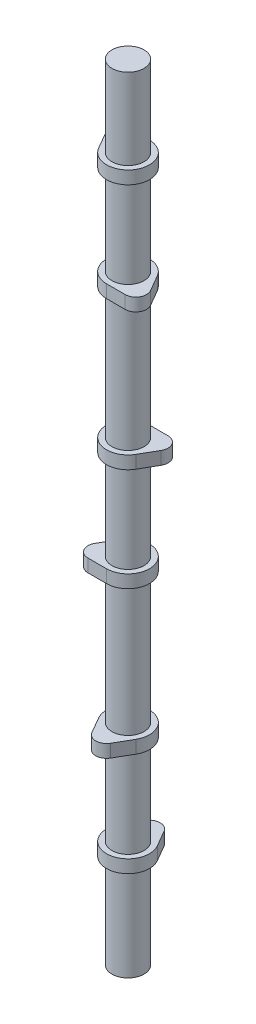
ISO-10303-21;
HEADER;
FILE_DESCRIPTION(('STEP AP214'),'2;1');
FILE_NAME('part.step','',(''),(''),'','','');
FILE_SCHEMA(('AUTOMOTIVE_DESIGN { 1 0 10303 214 1 1 1 1 }'));
ENDSEC;
DATA;
#1=APPLICATION_CONTEXT('core data for automotive mechanical design processes');
#2=APPLICATION_PROTOCOL_DEFINITION('international standard','automotive_design',2000,#1);
#3=PRODUCT_CONTEXT('',#1,'mechanical');
#4=PRODUCT('Part','Part','',(#3));
#5=PRODUCT_RELATED_PRODUCT_CATEGORY('part','',(#4));
#6=PRODUCT_DEFINITION_FORMATION('','',#4);
#7=PRODUCT_DEFINITION_CONTEXT('part definition',#1,'design');
#8=PRODUCT_DEFINITION('design','',#6,#7);
#9=PRODUCT_DEFINITION_SHAPE('','',#8);
#10=(LENGTH_UNIT() NAMED_UNIT(*) SI_UNIT(.MILLI.,.METRE.));
#11=(NAMED_UNIT(*) PLANE_ANGLE_UNIT() SI_UNIT($,.RADIAN.));
#12=(NAMED_UNIT(*) SI_UNIT($,.STERADIAN.) SOLID_ANGLE_UNIT());
#13=UNCERTAINTY_MEASURE_WITH_UNIT(LENGTH_MEASURE(1.E-05),#10,'distance_accuracy_value','');
#14=(GEOMETRIC_REPRESENTATION_CONTEXT(3) GLOBAL_UNCERTAINTY_ASSIGNED_CONTEXT((#13)) GLOBAL_UNIT_ASSIGNED_CONTEXT((#10,
#11,#12)) REPRESENTATION_CONTEXT('',''));
#15=CARTESIAN_POINT('',(0.,0.,0.));
#16=DIRECTION('',(0.,0.,1.));
#17=DIRECTION('',(1.,0.,0.));
#18=AXIS2_PLACEMENT_3D('',#15,#16,#17);
#19=CARTESIAN_POINT('',(0.,404.72,0.));
#20=DIRECTION('',(0.,-1.,0.));
#21=DIRECTION('',(0.,0.,-1.));
#22=AXIS2_PLACEMENT_3D('',#19,#20,#21);
#23=CYLINDRICAL_SURFACE('',#22,9.5);
#24=CARTESIAN_POINT('',(0.,210.82,0.));
#25=DIRECTION('',(0.,1.,0.));
#26=DIRECTION('',(0.,0.,1.));
#27=AXIS2_PLACEMENT_3D('',#24,#25,#26);
#28=CIRCLE('',#27,9.5);
#29=CARTESIAN_POINT('',(0.,210.82,9.5));
#30=VERTEX_POINT('',#29);
#31=EDGE_CURVE('E304',#30,#30,#28,.T.);
#32=ORIENTED_EDGE('',*,*,#31,.T.);
#33=EDGE_LOOP('',(#32));
#34=FACE_BOUND('',#33,.T.);
#35=CARTESIAN_POINT('',(0.,288.29,0.));
#36=DIRECTION('',(0.,1.,0.));
#37=DIRECTION('',(0.,0.,1.));
#38=AXIS2_PLACEMENT_3D('',#35,#36,#37);
#39=CIRCLE('',#38,9.5);
#40=CARTESIAN_POINT('',(0.,288.29,9.5));
#41=VERTEX_POINT('',#40);
#42=EDGE_CURVE('E11',#41,#41,#39,.T.);
#43=ORIENTED_EDGE('',*,*,#42,.F.);
#44=EDGE_LOOP('',(#43));
#45=FACE_BOUND('',#44,.T.);
#46=ADVANCED_FACE('F39',(#34,#45),#23,.T.);
#47=CARTESIAN_POINT('',(0.,149.86,0.));
#48=DIRECTION('',(0.,1.,0.));
#49=DIRECTION('',(0.,0.,1.));
#50=AXIS2_PLACEMENT_3D('',#47,#48,#49);
#51=CIRCLE('',#50,9.5);
#52=CARTESIAN_POINT('',(0.,149.86,9.5));
#53=VERTEX_POINT('',#52);
#54=EDGE_CURVE('E335',#53,#53,#51,.T.);
#55=ORIENTED_EDGE('',*,*,#54,.T.);
#56=EDGE_LOOP('',(#55));
#57=FACE_BOUND('',#56,.T.);
#58=CARTESIAN_POINT('',(0.,203.2,0.));
#59=DIRECTION('',(0.,1.,0.));
#60=DIRECTION('',(0.,0.,1.));
#61=AXIS2_PLACEMENT_3D('',#58,#59,#60);
#62=CIRCLE('',#61,9.5);
#63=CARTESIAN_POINT('',(0.,203.2,9.5));
#64=VERTEX_POINT('',#63);
#65=EDGE_CURVE('E408',#64,#64,#62,.T.);
#66=ORIENTED_EDGE('',*,*,#65,.F.);
#67=EDGE_LOOP('',(#66));
#68=FACE_BOUND('',#67,.T.);
#69=ADVANCED_FACE('F457',(#57,#68),#23,.T.);
#70=CARTESIAN_POINT('',(0.,64.77,0.));
#71=DIRECTION('',(0.,1.,0.));
#72=DIRECTION('',(0.,0.,1.));
#73=AXIS2_PLACEMENT_3D('',#70,#71,#72);
#74=CIRCLE('',#73,9.5);
#75=CARTESIAN_POINT('',(0.,64.77,9.5));
#76=VERTEX_POINT('',#75);
#77=EDGE_CURVE('E366',#76,#76,#74,.T.);
#78=ORIENTED_EDGE('',*,*,#77,.T.);
#79=EDGE_LOOP('',(#78));
#80=FACE_BOUND('',#79,.T.);
#81=CARTESIAN_POINT('',(0.,142.24,0.));
#82=DIRECTION('',(0.,1.,0.));
#83=DIRECTION('',(0.,0.,1.));
#84=AXIS2_PLACEMENT_3D('',#81,#82,#83);
#85=CIRCLE('',#84,9.5);
#86=CARTESIAN_POINT('',(0.,142.24,9.5));
#87=VERTEX_POINT('',#86);
#88=EDGE_CURVE('E403',#87,#87,#85,.T.);
#89=ORIENTED_EDGE('',*,*,#88,.F.);
#90=EDGE_LOOP('',(#89));
#91=FACE_BOUND('',#90,.T.);
#92=ADVANCED_FACE('F465',(#80,#91),#23,.T.);
#93=CARTESIAN_POINT('',(0.,3.80999999999998,0.));
#94=DIRECTION('',(0.,1.,0.));
#95=DIRECTION('',(0.,0.,1.));
#96=AXIS2_PLACEMENT_3D('',#93,#94,#95);
#97=CIRCLE('',#96,9.5);
#98=CARTESIAN_POINT('',(0.,3.80999999999998,9.5));
#99=VERTEX_POINT('',#98);
#100=EDGE_CURVE('E370',#99,#99,#97,.F.);
#101=ORIENTED_EDGE('',*,*,#100,.F.);
#102=EDGE_LOOP('',(#101));
#103=FACE_BOUND('',#102,.T.);
#104=CARTESIAN_POINT('',(0.,57.15,0.));
#105=DIRECTION('',(0.,1.,0.));
#106=DIRECTION('',(0.,0.,1.));
#107=AXIS2_PLACEMENT_3D('',#104,#105,#106);
#108=CIRCLE('',#107,9.5);
#109=CARTESIAN_POINT('',(0.,57.15,9.5));
#110=VERTEX_POINT('',#109);
#111=EDGE_CURVE('E400',#110,#110,#108,.T.);
#112=ORIENTED_EDGE('',*,*,#111,.F.);
#113=EDGE_LOOP('',(#112));
#114=FACE_BOUND('',#113,.T.);
#115=ADVANCED_FACE('F483',(#103,#114),#23,.T.);
#116=CARTESIAN_POINT('',(0.,3.81,-12.7));
#117=DIRECTION('',(0.,-1.,0.));
#118=DIRECTION('',(0.,0.,-1.));
#119=AXIS2_PLACEMENT_3D('',#116,#117,#118);
#120=CYLINDRICAL_SURFACE('',#119,6.35);
#121=CARTESIAN_POINT('',(0.,-3.81,-12.7));
#122=DIRECTION('',(0.,1.,0.));
#123=DIRECTION('',(0.,0.,1.));
#124=AXIS2_PLACEMENT_3D('',#121,#122,#123);
#125=CIRCLE('',#124,6.35);
#126=CARTESIAN_POINT('',(5.49926131403118,-3.81,-15.875));
#127=VERTEX_POINT('',#126);
#128=CARTESIAN_POINT('',(-5.49926131403118,-3.81,-15.875));
#129=VERTEX_POINT('',#128);
#130=EDGE_CURVE('E376',#127,#129,#125,.T.);
#131=ORIENTED_EDGE('',*,*,#130,.T.);
#132=DIRECTION('',(0.,-1.,0.));
#133=VECTOR('',#132,1.);
#134=CARTESIAN_POINT('',(-5.49926131403118,3.81,-15.875));
#135=LINE('',#134,#133);
#136=CARTESIAN_POINT('',(-5.49926131403118,3.81,-15.875));
#137=VERTEX_POINT('',#136);
#138=EDGE_CURVE('E395',#137,#129,#135,.T.);
#139=ORIENTED_EDGE('',*,*,#138,.F.);
#140=CARTESIAN_POINT('',(0.,3.81,-12.7));
#141=DIRECTION('',(0.,1.,0.));
#142=DIRECTION('',(0.,0.,1.));
#143=AXIS2_PLACEMENT_3D('',#140,#141,#142);
#144=CIRCLE('',#143,6.35);
#145=CARTESIAN_POINT('',(5.49926131403118,3.81,-15.875));
#146=VERTEX_POINT('',#145);
#147=EDGE_CURVE('E377',#146,#137,#144,.T.);
#148=ORIENTED_EDGE('',*,*,#147,.F.);
#149=DIRECTION('',(0.,-1.,0.));
#150=VECTOR('',#149,1.);
#151=CARTESIAN_POINT('',(5.49926131403118,3.81,-15.875));
#152=LINE('',#151,#150);
#153=EDGE_CURVE('E383',#146,#127,#152,.T.);
#154=ORIENTED_EDGE('',*,*,#153,.T.);
#155=EDGE_LOOP('',(#131,#139,#148,#154));
#156=FACE_BOUND('',#155,.T.);
#157=ADVANCED_FACE('F41',(#156),#120,.T.);
#158=CARTESIAN_POINT('',(-5.49926131403118,3.81,-15.875));
#159=DIRECTION('',(0.866025403784439,0.,0.5));
#160=DIRECTION('',(0.5,0.,-0.866025403784439));
#161=AXIS2_PLACEMENT_3D('',#158,#159,#160);
#162=PLANE('',#161);
#163=DIRECTION('',(-0.5,0.,0.866025403784439));
#164=VECTOR('',#163,1.);
#165=CARTESIAN_POINT('',(-5.49926131403118,-3.81,-15.875));
#166=LINE('',#165,#164);
#167=CARTESIAN_POINT('',(-10.9985226280624,-3.81,-6.35));
#168=VERTEX_POINT('',#167);
#169=EDGE_CURVE('E386',#129,#168,#166,.T.);
#170=ORIENTED_EDGE('',*,*,#169,.T.);
#171=DIRECTION('',(0.,-1.,0.));
#172=VECTOR('',#171,1.);
#173=CARTESIAN_POINT('',(-10.9985226280624,3.81,-6.35));
#174=LINE('',#173,#172);
#175=CARTESIAN_POINT('',(-10.9985226280624,3.81,-6.35));
#176=VERTEX_POINT('',#175);
#177=EDGE_CURVE('E393',#176,#168,#174,.T.);
#178=ORIENTED_EDGE('',*,*,#177,.F.);
#179=DIRECTION('',(-0.5,0.,0.866025403784439));
#180=VECTOR('',#179,1.);
#181=CARTESIAN_POINT('',(-5.49926131403118,3.81,-15.875));
#182=LINE('',#181,#180);
#183=EDGE_CURVE('E89',#137,#176,#182,.T.);
#184=ORIENTED_EDGE('',*,*,#183,.F.);
#185=ORIENTED_EDGE('',*,*,#138,.T.);
#186=EDGE_LOOP('',(#170,#178,#184,#185));
#187=FACE_BOUND('',#186,.T.);
#188=ADVANCED_FACE('F500',(#187),#162,.F.);
#189=CARTESIAN_POINT('',(0.,3.81,0.));
#190=DIRECTION('',(0.,-1.,0.));
#191=DIRECTION('',(0.,0.,-1.));
#192=AXIS2_PLACEMENT_3D('',#189,#190,#191);
#193=CYLINDRICAL_SURFACE('',#192,12.7);
#194=CARTESIAN_POINT('',(0.,-3.81,0.));
#195=DIRECTION('',(0.,1.,0.));
#196=DIRECTION('',(0.,0.,1.));
#197=AXIS2_PLACEMENT_3D('',#194,#195,#196);
#198=CIRCLE('',#197,12.7);
#199=CARTESIAN_POINT('',(10.9985226280624,-3.81,-6.35000000000001));
#200=VERTEX_POINT('',#199);
#201=EDGE_CURVE('E75',#168,#200,#198,.T.);
#202=ORIENTED_EDGE('',*,*,#201,.T.);
#203=DIRECTION('',(0.,-1.,0.));
#204=VECTOR('',#203,1.);
#205=CARTESIAN_POINT('',(10.9985226280624,3.81,-6.35000000000001));
#206=LINE('',#205,#204);
#207=CARTESIAN_POINT('',(10.9985226280624,3.81,-6.35000000000001));
#208=VERTEX_POINT('',#207);
#209=EDGE_CURVE('E391',#208,#200,#206,.T.);
#210=ORIENTED_EDGE('',*,*,#209,.F.);
#211=CARTESIAN_POINT('',(0.,3.81,0.));
#212=DIRECTION('',(0.,1.,0.));
#213=DIRECTION('',(0.,0.,1.));
#214=AXIS2_PLACEMENT_3D('',#211,#212,#213);
#215=CIRCLE('',#214,12.7);
#216=EDGE_CURVE('E380',#176,#208,#215,.T.);
#217=ORIENTED_EDGE('',*,*,#216,.F.);
#218=ORIENTED_EDGE('',*,*,#177,.T.);
#219=EDGE_LOOP('',(#202,#210,#217,#218));
#220=FACE_BOUND('',#219,.T.);
#221=ADVANCED_FACE('F925',(#220),#193,.T.);
#222=CARTESIAN_POINT('',(5.49926131403118,3.81,-15.875));
#223=DIRECTION('',(-0.866025403784438,0.,0.5));
#224=DIRECTION('',(0.5,0.,0.866025403784439));
#225=AXIS2_PLACEMENT_3D('',#222,#223,#224);
#226=PLANE('',#225);
#227=DIRECTION('',(-0.5,0.,-0.866025403784439));
#228=VECTOR('',#227,1.);
#229=CARTESIAN_POINT('',(5.49926131403118,-3.81,-15.875));
#230=LINE('',#229,#228);
#231=EDGE_CURVE('E81',#200,#127,#230,.T.);
#232=ORIENTED_EDGE('',*,*,#231,.T.);
#233=ORIENTED_EDGE('',*,*,#153,.F.);
#234=DIRECTION('',(-0.5,0.,-0.866025403784439));
#235=VECTOR('',#234,1.);
#236=CARTESIAN_POINT('',(5.49926131403118,3.81,-15.875));
#237=LINE('',#236,#235);
#238=EDGE_CURVE('E57',#208,#146,#237,.T.);
#239=ORIENTED_EDGE('',*,*,#238,.F.);
#240=ORIENTED_EDGE('',*,*,#209,.T.);
#241=EDGE_LOOP('',(#232,#233,#239,#240));
#242=FACE_BOUND('',#241,.T.);
#243=ADVANCED_FACE('F916',(#242),#226,.F.);
#244=CARTESIAN_POINT('',(0.,3.81,-12.7));
#245=DIRECTION('',(0.,1.,0.));
#246=DIRECTION('',(0.,0.,1.));
#247=AXIS2_PLACEMENT_3D('',#244,#245,#246);
#248=PLANE('',#247);
#249=ORIENTED_EDGE('',*,*,#100,.T.);
#250=EDGE_LOOP('',(#249));
#251=FACE_BOUND('',#250,.T.);
#252=ORIENTED_EDGE('',*,*,#147,.T.);
#253=ORIENTED_EDGE('',*,*,#183,.T.);
#254=ORIENTED_EDGE('',*,*,#216,.T.);
#255=ORIENTED_EDGE('',*,*,#238,.T.);
#256=EDGE_LOOP('',(#252,#253,#254,#255));
#257=FACE_BOUND('',#256,.T.);
#258=ADVANCED_FACE('F906',(#251,#257),#248,.T.);
#259=CARTESIAN_POINT('',(0.,-3.81,-12.7));
#260=DIRECTION('',(0.,1.,0.));
#261=DIRECTION('',(0.,0.,1.));
#262=AXIS2_PLACEMENT_3D('',#259,#260,#261);
#263=PLANE('',#262);
#264=CARTESIAN_POINT('',(0.,-3.80999999999998,0.));
#265=DIRECTION('',(0.,1.,0.));
#266=DIRECTION('',(0.,0.,1.));
#267=AXIS2_PLACEMENT_3D('',#264,#265,#266);
#268=CIRCLE('',#267,9.5);
#269=CARTESIAN_POINT('',(0.,-3.80999999999998,9.5));
#270=VERTEX_POINT('',#269);
#271=EDGE_CURVE('E397',#270,#270,#268,.F.);
#272=ORIENTED_EDGE('',*,*,#271,.F.);
#273=EDGE_LOOP('',(#272));
#274=FACE_BOUND('',#273,.T.);
#275=ORIENTED_EDGE('',*,*,#130,.F.);
#276=ORIENTED_EDGE('',*,*,#231,.F.);
#277=ORIENTED_EDGE('',*,*,#201,.F.);
#278=ORIENTED_EDGE('',*,*,#169,.F.);
#279=EDGE_LOOP('',(#275,#276,#277,#278));
#280=FACE_BOUND('',#279,.T.);
#281=ADVANCED_FACE('F491',(#274,#280),#263,.F.);
#282=CARTESIAN_POINT('',(0.,-59.53,0.));
#283=DIRECTION('',(0.,1.,0.));
#284=DIRECTION('',(0.,0.,1.));
#285=AXIS2_PLACEMENT_3D('',#282,#283,#284);
#286=PLANE('',#285);
#287=CARTESIAN_POINT('',(0.,-59.53,0.));
#288=DIRECTION('',(0.,1.,0.));
#289=DIRECTION('',(0.,0.,1.));
#290=AXIS2_PLACEMENT_3D('',#287,#288,#289);
#291=CIRCLE('',#290,9.5);
#292=CARTESIAN_POINT('',(0.,-59.53,9.5));
#293=VERTEX_POINT('',#292);
#294=EDGE_CURVE('E371',#293,#293,#291,.T.);
#295=ORIENTED_EDGE('',*,*,#294,.F.);
#296=EDGE_LOOP('',(#295));
#297=FACE_BOUND('',#296,.T.);
#298=ADVANCED_FACE('F481',(#297),#286,.F.);
#299=ORIENTED_EDGE('',*,*,#294,.T.);
#300=EDGE_LOOP('',(#299));
#301=FACE_BOUND('',#300,.T.);
#302=ORIENTED_EDGE('',*,*,#271,.T.);
#303=EDGE_LOOP('',(#302));
#304=FACE_BOUND('',#303,.T.);
#305=ADVANCED_FACE('F472',(#301,#304),#23,.T.);
#306=CARTESIAN_POINT('',(0.,64.77,12.7));
#307=DIRECTION('',(0.,-1.,0.));
#308=DIRECTION('',(0.,0.,1.));
#309=AXIS2_PLACEMENT_3D('',#306,#307,#308);
#310=CYLINDRICAL_SURFACE('',#309,6.35);
#311=CARTESIAN_POINT('',(0.,57.15,12.7));
#312=DIRECTION('',(0.,1.,0.));
#313=DIRECTION('',(0.,0.,-1.));
#314=AXIS2_PLACEMENT_3D('',#311,#312,#313);
#315=CIRCLE('',#314,6.35);
#316=CARTESIAN_POINT('',(-5.49926131403129,57.15,15.875));
#317=VERTEX_POINT('',#316);
#318=CARTESIAN_POINT('',(5.49926131403107,57.15,15.875));
#319=VERTEX_POINT('',#318);
#320=EDGE_CURVE('E347',#317,#319,#315,.T.);
#321=ORIENTED_EDGE('',*,*,#320,.T.);
#322=DIRECTION('',(0.,-1.,0.));
#323=VECTOR('',#322,1.);
#324=CARTESIAN_POINT('',(5.49926131403107,64.77,15.875));
#325=LINE('',#324,#323);
#326=CARTESIAN_POINT('',(5.49926131403107,64.77,15.875));
#327=VERTEX_POINT('',#326);
#328=EDGE_CURVE('E363',#327,#319,#325,.T.);
#329=ORIENTED_EDGE('',*,*,#328,.F.);
#330=CARTESIAN_POINT('',(0.,64.77,12.7));
#331=DIRECTION('',(0.,1.,0.));
#332=DIRECTION('',(0.,0.,-1.));
#333=AXIS2_PLACEMENT_3D('',#330,#331,#332);
#334=CIRCLE('',#333,6.35);
#335=CARTESIAN_POINT('',(-5.49926131403129,64.77,15.875));
#336=VERTEX_POINT('',#335);
#337=EDGE_CURVE('E336',#336,#327,#334,.T.);
#338=ORIENTED_EDGE('',*,*,#337,.F.);
#339=DIRECTION('',(0.,-1.,0.));
#340=VECTOR('',#339,1.);
#341=CARTESIAN_POINT('',(-5.49926131403129,64.77,15.875));
#342=LINE('',#341,#340);
#343=EDGE_CURVE('E346',#336,#317,#342,.T.);
#344=ORIENTED_EDGE('',*,*,#343,.T.);
#345=EDGE_LOOP('',(#321,#329,#338,#344));
#346=FACE_BOUND('',#345,.T.);
#347=ADVANCED_FACE('F480',(#346),#310,.T.);
#348=CARTESIAN_POINT('',(5.49926131403107,64.77,15.875));
#349=DIRECTION('',(-0.866025403784435,0.,-0.500000000000006));
#350=DIRECTION('',(-0.500000000000006,0.,0.866025403784435));
#351=AXIS2_PLACEMENT_3D('',#348,#349,#350);
#352=PLANE('',#351);
#353=DIRECTION('',(0.500000000000006,0.,-0.866025403784435));
#354=VECTOR('',#353,1.);
#355=CARTESIAN_POINT('',(5.49926131403107,57.15,15.875));
#356=LINE('',#355,#354);
#357=CARTESIAN_POINT('',(10.9985226280623,57.15,6.35000000000008));
#358=VERTEX_POINT('',#357);
#359=EDGE_CURVE('E350',#319,#358,#356,.T.);
#360=ORIENTED_EDGE('',*,*,#359,.T.);
#361=DIRECTION('',(0.,-1.,0.));
#362=VECTOR('',#361,1.);
#363=CARTESIAN_POINT('',(10.9985226280623,64.77,6.35000000000008));
#364=LINE('',#363,#362);
#365=CARTESIAN_POINT('',(10.9985226280623,64.77,6.35000000000008));
#366=VERTEX_POINT('',#365);
#367=EDGE_CURVE('E360',#366,#358,#364,.T.);
#368=ORIENTED_EDGE('',*,*,#367,.F.);
#369=DIRECTION('',(0.500000000000006,0.,-0.866025403784435));
#370=VECTOR('',#369,1.);
#371=CARTESIAN_POINT('',(5.49926131403107,64.77,15.875));
#372=LINE('',#371,#370);
#373=EDGE_CURVE('E339',#327,#366,#372,.T.);
#374=ORIENTED_EDGE('',*,*,#373,.F.);
#375=ORIENTED_EDGE('',*,*,#328,.T.);
#376=EDGE_LOOP('',(#360,#368,#374,#375));
#377=FACE_BOUND('',#376,.T.);
#378=ADVANCED_FACE('F488',(#377),#352,.F.);
#379=CARTESIAN_POINT('',(0.,64.77,0.));
#380=DIRECTION('',(0.,-1.,0.));
#381=DIRECTION('',(0.,0.,1.));
#382=AXIS2_PLACEMENT_3D('',#379,#380,#381);
#383=CYLINDRICAL_SURFACE('',#382,12.7);
#384=CARTESIAN_POINT('',(0.,57.15,0.));
#385=DIRECTION('',(0.,1.,0.));
#386=DIRECTION('',(0.,0.,-1.));
#387=AXIS2_PLACEMENT_3D('',#384,#385,#386);
#388=CIRCLE('',#387,12.7);
#389=CARTESIAN_POINT('',(-10.9985226280624,57.15,6.34999999999994));
#390=VERTEX_POINT('',#389);
#391=EDGE_CURVE('E352',#358,#390,#388,.T.);
#392=ORIENTED_EDGE('',*,*,#391,.T.);
#393=DIRECTION('',(0.,-1.,0.));
#394=VECTOR('',#393,1.);
#395=CARTESIAN_POINT('',(-10.9985226280624,64.77,6.34999999999994));
#396=LINE('',#395,#394);
#397=CARTESIAN_POINT('',(-10.9985226280624,64.77,6.34999999999994));
#398=VERTEX_POINT('',#397);
#399=EDGE_CURVE('E357',#398,#390,#396,.T.);
#400=ORIENTED_EDGE('',*,*,#399,.F.);
#401=CARTESIAN_POINT('',(0.,64.77,0.));
#402=DIRECTION('',(0.,1.,0.));
#403=DIRECTION('',(0.,0.,-1.));
#404=AXIS2_PLACEMENT_3D('',#401,#402,#403);
#405=CIRCLE('',#404,12.7);
#406=EDGE_CURVE('E342',#366,#398,#405,.T.);
#407=ORIENTED_EDGE('',*,*,#406,.F.);
#408=ORIENTED_EDGE('',*,*,#367,.T.);
#409=EDGE_LOOP('',(#392,#400,#407,#408));
#410=FACE_BOUND('',#409,.T.);
#411=ADVANCED_FACE('F525',(#410),#383,.T.);
#412=CARTESIAN_POINT('',(-5.49926131403129,64.77,15.875));
#413=DIRECTION('',(0.866025403784442,0.,-0.499999999999994));
#414=DIRECTION('',(-0.499999999999994,0.,-0.866025403784442));
#415=AXIS2_PLACEMENT_3D('',#412,#413,#414);
#416=PLANE('',#415);
#417=DIRECTION('',(0.499999999999994,0.,0.866025403784442));
#418=VECTOR('',#417,1.);
#419=CARTESIAN_POINT('',(-5.49926131403129,57.15,15.875));
#420=LINE('',#419,#418);
#421=EDGE_CURVE('E340',#390,#317,#420,.T.);
#422=ORIENTED_EDGE('',*,*,#421,.T.);
#423=ORIENTED_EDGE('',*,*,#343,.F.);
#424=DIRECTION('',(0.499999999999994,0.,0.866025403784442));
#425=VECTOR('',#424,1.);
#426=CARTESIAN_POINT('',(-5.49926131403129,64.77,15.875));
#427=LINE('',#426,#425);
#428=EDGE_CURVE('E344',#398,#336,#427,.T.);
#429=ORIENTED_EDGE('',*,*,#428,.F.);
#430=ORIENTED_EDGE('',*,*,#399,.T.);
#431=EDGE_LOOP('',(#422,#423,#429,#430));
#432=FACE_BOUND('',#431,.T.);
#433=ADVANCED_FACE('F521',(#432),#416,.F.);
#434=CARTESIAN_POINT('',(0.,64.77,12.7));
#435=DIRECTION('',(0.,1.,0.));
#436=DIRECTION('',(0.,0.,-1.));
#437=AXIS2_PLACEMENT_3D('',#434,#435,#436);
#438=PLANE('',#437);
#439=ORIENTED_EDGE('',*,*,#77,.F.);
#440=EDGE_LOOP('',(#439));
#441=FACE_BOUND('',#440,.T.);
#442=ORIENTED_EDGE('',*,*,#337,.T.);
#443=ORIENTED_EDGE('',*,*,#373,.T.);
#444=ORIENTED_EDGE('',*,*,#406,.T.);
#445=ORIENTED_EDGE('',*,*,#428,.T.);
#446=EDGE_LOOP('',(#442,#443,#444,#445));
#447=FACE_BOUND('',#446,.T.);
#448=ADVANCED_FACE('F511',(#441,#447),#438,.T.);
#449=CARTESIAN_POINT('',(0.,57.15,12.7));
#450=DIRECTION('',(0.,1.,0.));
#451=DIRECTION('',(0.,0.,-1.));
#452=AXIS2_PLACEMENT_3D('',#449,#450,#451);
#453=PLANE('',#452);
#454=ORIENTED_EDGE('',*,*,#111,.T.);
#455=EDGE_LOOP('',(#454));
#456=FACE_BOUND('',#455,.T.);
#457=ORIENTED_EDGE('',*,*,#320,.F.);
#458=ORIENTED_EDGE('',*,*,#421,.F.);
#459=ORIENTED_EDGE('',*,*,#391,.F.);
#460=ORIENTED_EDGE('',*,*,#359,.F.);
#461=EDGE_LOOP('',(#457,#458,#459,#460));
#462=FACE_BOUND('',#461,.T.);
#463=ADVANCED_FACE('F507',(#456,#462),#453,.F.);
#464=CARTESIAN_POINT('',(-10.9985226280623,149.86,6.35000000000005));
#465=DIRECTION('',(0.,-1.,0.));
#466=DIRECTION('',(-0.866025403784436,0.,0.500000000000004));
#467=AXIS2_PLACEMENT_3D('',#464,#465,#466);
#468=CYLINDRICAL_SURFACE('',#467,6.35);
#469=CARTESIAN_POINT('',(-10.9985226280623,142.24,6.35000000000005));
#470=DIRECTION('',(0.,1.,0.));
#471=DIRECTION('',(0.866025403784436,0.,-0.500000000000004));
#472=AXIS2_PLACEMENT_3D('',#469,#470,#471);
#473=CIRCLE('',#472,6.35);
#474=CARTESIAN_POINT('',(-16.4977839420935,142.24,3.17500000000008));
#475=VERTEX_POINT('',#474);
#476=CARTESIAN_POINT('',(-10.9985226280623,142.24,12.7000000000001));
#477=VERTEX_POINT('',#476);
#478=EDGE_CURVE('E316',#475,#477,#473,.T.);
#479=ORIENTED_EDGE('',*,*,#478,.T.);
#480=DIRECTION('',(0.,-1.,0.));
#481=VECTOR('',#480,1.);
#482=CARTESIAN_POINT('',(-10.9985226280623,149.86,12.7000000000001));
#483=LINE('',#482,#481);
#484=CARTESIAN_POINT('',(-10.9985226280623,149.86,12.7000000000001));
#485=VERTEX_POINT('',#484);
#486=EDGE_CURVE('E332',#485,#477,#483,.T.);
#487=ORIENTED_EDGE('',*,*,#486,.F.);
#488=CARTESIAN_POINT('',(-10.9985226280623,149.86,6.35000000000005));
#489=DIRECTION('',(0.,1.,0.));
#490=DIRECTION('',(0.866025403784436,0.,-0.500000000000004));
#491=AXIS2_PLACEMENT_3D('',#488,#489,#490);
#492=CIRCLE('',#491,6.35);
#493=CARTESIAN_POINT('',(-16.4977839420935,149.86,3.17500000000008));
#494=VERTEX_POINT('',#493);
#495=EDGE_CURVE('E305',#494,#485,#492,.T.);
#496=ORIENTED_EDGE('',*,*,#495,.F.);
#497=DIRECTION('',(0.,-1.,0.));
#498=VECTOR('',#497,1.);
#499=CARTESIAN_POINT('',(-16.4977839420935,149.86,3.17500000000008));
#500=LINE('',#499,#498);
#501=EDGE_CURVE('E315',#494,#475,#500,.T.);
#502=ORIENTED_EDGE('',*,*,#501,.T.);
#503=EDGE_LOOP('',(#479,#487,#496,#502));
#504=FACE_BOUND('',#503,.T.);
#505=ADVANCED_FACE('F510',(#504),#468,.T.);
#506=CARTESIAN_POINT('',(-10.9985226280623,149.86,12.7000000000001));
#507=DIRECTION('',(0.,0.,-1.));
#508=DIRECTION('',(-1.,0.,0.));
#509=AXIS2_PLACEMENT_3D('',#506,#507,#508);
#510=PLANE('',#509);
#511=DIRECTION('',(1.,0.,0.));
#512=VECTOR('',#511,1.);
#513=CARTESIAN_POINT('',(-10.9985226280623,142.24,12.7000000000001));
#514=LINE('',#513,#512);
#515=CARTESIAN_POINT('',(0.,142.24,12.7));
#516=VERTEX_POINT('',#515);
#517=EDGE_CURVE('E319',#477,#516,#514,.T.);
#518=ORIENTED_EDGE('',*,*,#517,.T.);
#519=DIRECTION('',(0.,-1.,0.));
#520=VECTOR('',#519,1.);
#521=CARTESIAN_POINT('',(0.,149.86,12.7));
#522=LINE('',#521,#520);
#523=CARTESIAN_POINT('',(0.,149.86,12.7));
#524=VERTEX_POINT('',#523);
#525=EDGE_CURVE('E329',#524,#516,#522,.T.);
#526=ORIENTED_EDGE('',*,*,#525,.F.);
#527=DIRECTION('',(1.,0.,0.));
#528=VECTOR('',#527,1.);
#529=CARTESIAN_POINT('',(-10.9985226280623,149.86,12.7000000000001));
#530=LINE('',#529,#528);
#531=EDGE_CURVE('E308',#485,#524,#530,.T.);
#532=ORIENTED_EDGE('',*,*,#531,.F.);
#533=ORIENTED_EDGE('',*,*,#486,.T.);
#534=EDGE_LOOP('',(#518,#526,#532,#533));
#535=FACE_BOUND('',#534,.T.);
#536=ADVANCED_FACE('F577',(#535),#510,.F.);
#537=CARTESIAN_POINT('',(0.,149.86,0.));
#538=DIRECTION('',(0.,-1.,0.));
#539=DIRECTION('',(-0.866025403784436,0.,0.500000000000004));
#540=AXIS2_PLACEMENT_3D('',#537,#538,#539);
#541=CYLINDRICAL_SURFACE('',#540,12.7);
#542=CARTESIAN_POINT('',(0.,142.24,0.));
#543=DIRECTION('',(0.,1.,0.));
#544=DIRECTION('',(0.866025403784436,0.,-0.500000000000004));
#545=AXIS2_PLACEMENT_3D('',#542,#543,#544);
#546=CIRCLE('',#545,12.7);
#547=CARTESIAN_POINT('',(-10.9985226280624,142.24,-6.34999999999994));
#548=VERTEX_POINT('',#547);
#549=EDGE_CURVE('E321',#516,#548,#546,.T.);
#550=ORIENTED_EDGE('',*,*,#549,.T.);
#551=DIRECTION('',(0.,-1.,0.));
#552=VECTOR('',#551,1.);
#553=CARTESIAN_POINT('',(-10.9985226280624,149.86,-6.34999999999994));
#554=LINE('',#553,#552);
#555=CARTESIAN_POINT('',(-10.9985226280624,149.86,-6.34999999999994));
#556=VERTEX_POINT('',#555);
#557=EDGE_CURVE('E326',#556,#548,#554,.T.);
#558=ORIENTED_EDGE('',*,*,#557,.F.);
#559=CARTESIAN_POINT('',(0.,149.86,0.));
#560=DIRECTION('',(0.,1.,0.));
#561=DIRECTION('',(0.866025403784436,0.,-0.500000000000004));
#562=AXIS2_PLACEMENT_3D('',#559,#560,#561);
#563=CIRCLE('',#562,12.7);
#564=EDGE_CURVE('E311',#524,#556,#563,.T.);
#565=ORIENTED_EDGE('',*,*,#564,.F.);
#566=ORIENTED_EDGE('',*,*,#525,.T.);
#567=EDGE_LOOP('',(#550,#558,#565,#566));
#568=FACE_BOUND('',#567,.T.);
#569=ADVANCED_FACE('F587',(#568),#541,.T.);
#570=CARTESIAN_POINT('',(-16.4977839420935,149.86,3.17500000000008));
#571=DIRECTION('',(0.866025403784441,0.,0.499999999999996));
#572=DIRECTION('',(0.499999999999996,0.,-0.866025403784441));
#573=AXIS2_PLACEMENT_3D('',#570,#571,#572);
#574=PLANE('',#573);
#575=DIRECTION('',(-0.499999999999996,0.,0.866025403784441));
#576=VECTOR('',#575,1.);
#577=CARTESIAN_POINT('',(-16.4977839420935,142.24,3.17500000000008));
#578=LINE('',#577,#576);
#579=EDGE_CURVE('E309',#548,#475,#578,.T.);
#580=ORIENTED_EDGE('',*,*,#579,.T.);
#581=ORIENTED_EDGE('',*,*,#501,.F.);
#582=DIRECTION('',(-0.499999999999996,0.,0.866025403784441));
#583=VECTOR('',#582,1.);
#584=CARTESIAN_POINT('',(-16.4977839420935,149.86,3.17500000000008));
#585=LINE('',#584,#583);
#586=EDGE_CURVE('E313',#556,#494,#585,.T.);
#587=ORIENTED_EDGE('',*,*,#586,.F.);
#588=ORIENTED_EDGE('',*,*,#557,.T.);
#589=EDGE_LOOP('',(#580,#581,#587,#588));
#590=FACE_BOUND('',#589,.T.);
#591=ADVANCED_FACE('F597',(#590),#574,.F.);
#592=CARTESIAN_POINT('',(-10.9985226280623,149.86,6.35000000000005));
#593=DIRECTION('',(0.,1.,0.));
#594=DIRECTION('',(0.866025403784436,0.,-0.500000000000004));
#595=AXIS2_PLACEMENT_3D('',#592,#593,#594);
#596=PLANE('',#595);
#597=ORIENTED_EDGE('',*,*,#54,.F.);
#598=EDGE_LOOP('',(#597));
#599=FACE_BOUND('',#598,.T.);
#600=ORIENTED_EDGE('',*,*,#495,.T.);
#601=ORIENTED_EDGE('',*,*,#531,.T.);
#602=ORIENTED_EDGE('',*,*,#564,.T.);
#603=ORIENTED_EDGE('',*,*,#586,.T.);
#604=EDGE_LOOP('',(#600,#601,#602,#603));
#605=FACE_BOUND('',#604,.T.);
#606=ADVANCED_FACE('F608',(#599,#605),#596,.T.);
#607=CARTESIAN_POINT('',(-10.9985226280623,142.24,6.35000000000005));
#608=DIRECTION('',(0.,1.,0.));
#609=DIRECTION('',(0.866025403784436,0.,-0.500000000000004));
#610=AXIS2_PLACEMENT_3D('',#607,#608,#609);
#611=PLANE('',#610);
#612=ORIENTED_EDGE('',*,*,#88,.T.);
#613=EDGE_LOOP('',(#612));
#614=FACE_BOUND('',#613,.T.);
#615=ORIENTED_EDGE('',*,*,#478,.F.);
#616=ORIENTED_EDGE('',*,*,#579,.F.);
#617=ORIENTED_EDGE('',*,*,#549,.F.);
#618=ORIENTED_EDGE('',*,*,#517,.F.);
#619=EDGE_LOOP('',(#615,#616,#617,#618));
#620=FACE_BOUND('',#619,.T.);
#621=ADVANCED_FACE('F619',(#614,#620),#611,.F.);
#622=CARTESIAN_POINT('',(10.9985226280624,210.82,-6.34999999999997));
#623=DIRECTION('',(0.,-1.,0.));
#624=DIRECTION('',(0.86602540378444,0.,-0.499999999999998));
#625=AXIS2_PLACEMENT_3D('',#622,#623,#624);
#626=CYLINDRICAL_SURFACE('',#625,6.35);
#627=CARTESIAN_POINT('',(10.9985226280624,203.2,-6.34999999999997));
#628=DIRECTION('',(0.,1.,0.));
#629=DIRECTION('',(-0.86602540378444,0.,0.499999999999998));
#630=AXIS2_PLACEMENT_3D('',#627,#628,#629);
#631=CIRCLE('',#630,6.35);
#632=CARTESIAN_POINT('',(16.4977839420936,203.2,-3.17499999999996));
#633=VERTEX_POINT('',#632);
#634=CARTESIAN_POINT('',(10.9985226280624,203.2,-12.7));
#635=VERTEX_POINT('',#634);
#636=EDGE_CURVE('E285',#633,#635,#631,.T.);
#637=ORIENTED_EDGE('',*,*,#636,.T.);
#638=DIRECTION('',(0.,-1.,0.));
#639=VECTOR('',#638,1.);
#640=CARTESIAN_POINT('',(10.9985226280624,210.82,-12.7));
#641=LINE('',#640,#639);
#642=CARTESIAN_POINT('',(10.9985226280624,210.82,-12.7));
#643=VERTEX_POINT('',#642);
#644=EDGE_CURVE('E301',#643,#635,#641,.T.);
#645=ORIENTED_EDGE('',*,*,#644,.F.);
#646=CARTESIAN_POINT('',(10.9985226280624,210.82,-6.34999999999997));
#647=DIRECTION('',(0.,1.,0.));
#648=DIRECTION('',(-0.86602540378444,0.,0.499999999999998));
#649=AXIS2_PLACEMENT_3D('',#646,#647,#648);
#650=CIRCLE('',#649,6.35);
#651=CARTESIAN_POINT('',(16.4977839420936,210.82,-3.17499999999996));
#652=VERTEX_POINT('',#651);
#653=EDGE_CURVE('E274',#652,#643,#650,.T.);
#654=ORIENTED_EDGE('',*,*,#653,.F.);
#655=DIRECTION('',(0.,-1.,0.));
#656=VECTOR('',#655,1.);
#657=CARTESIAN_POINT('',(16.4977839420936,210.82,-3.17499999999996));
#658=LINE('',#657,#656);
#659=EDGE_CURVE('E284',#652,#633,#658,.T.);
#660=ORIENTED_EDGE('',*,*,#659,.T.);
#661=EDGE_LOOP('',(#637,#645,#654,#660));
#662=FACE_BOUND('',#661,.T.);
#663=ADVANCED_FACE('F630',(#662),#626,.T.);
#664=CARTESIAN_POINT('',(10.9985226280624,210.82,-12.7));
#665=DIRECTION('',(0.,0.,1.));
#666=DIRECTION('',(1.,0.,0.));
#667=AXIS2_PLACEMENT_3D('',#664,#665,#666);
#668=PLANE('',#667);
#669=DIRECTION('',(-1.,0.,0.));
#670=VECTOR('',#669,1.);
#671=CARTESIAN_POINT('',(10.9985226280624,203.2,-12.7));
#672=LINE('',#671,#670);
#673=CARTESIAN_POINT('',(0.,203.2,-12.7));
#674=VERTEX_POINT('',#673);
#675=EDGE_CURVE('E288',#635,#674,#672,.T.);
#676=ORIENTED_EDGE('',*,*,#675,.T.);
#677=DIRECTION('',(0.,-1.,0.));
#678=VECTOR('',#677,1.);
#679=CARTESIAN_POINT('',(0.,210.82,-12.7));
#680=LINE('',#679,#678);
#681=CARTESIAN_POINT('',(0.,210.82,-12.7));
#682=VERTEX_POINT('',#681);
#683=EDGE_CURVE('E298',#682,#674,#680,.T.);
#684=ORIENTED_EDGE('',*,*,#683,.F.);
#685=DIRECTION('',(-1.,0.,0.));
#686=VECTOR('',#685,1.);
#687=CARTESIAN_POINT('',(10.9985226280624,210.82,-12.7));
#688=LINE('',#687,#686);
#689=EDGE_CURVE('E277',#643,#682,#688,.T.);
#690=ORIENTED_EDGE('',*,*,#689,.F.);
#691=ORIENTED_EDGE('',*,*,#644,.T.);
#692=EDGE_LOOP('',(#676,#684,#690,#691));
#693=FACE_BOUND('',#692,.T.);
#694=ADVANCED_FACE('F641',(#693),#668,.F.);
#695=CARTESIAN_POINT('',(0.,210.82,0.));
#696=DIRECTION('',(0.,-1.,0.));
#697=DIRECTION('',(0.86602540378444,0.,-0.499999999999998));
#698=AXIS2_PLACEMENT_3D('',#695,#696,#697);
#699=CYLINDRICAL_SURFACE('',#698,12.7);
#700=CARTESIAN_POINT('',(0.,203.2,0.));
#701=DIRECTION('',(0.,1.,0.));
#702=DIRECTION('',(-0.86602540378444,0.,0.499999999999998));
#703=AXIS2_PLACEMENT_3D('',#700,#701,#702);
#704=CIRCLE('',#703,12.7);
#705=CARTESIAN_POINT('',(10.9985226280624,203.2,6.35000000000001));
#706=VERTEX_POINT('',#705);
#707=EDGE_CURVE('E290',#674,#706,#704,.T.);
#708=ORIENTED_EDGE('',*,*,#707,.T.);
#709=DIRECTION('',(0.,-1.,0.));
#710=VECTOR('',#709,1.);
#711=CARTESIAN_POINT('',(10.9985226280624,210.82,6.35000000000001));
#712=LINE('',#711,#710);
#713=CARTESIAN_POINT('',(10.9985226280624,210.82,6.35000000000001));
#714=VERTEX_POINT('',#713);
#715=EDGE_CURVE('E295',#714,#706,#712,.T.);
#716=ORIENTED_EDGE('',*,*,#715,.F.);
#717=CARTESIAN_POINT('',(0.,210.82,0.));
#718=DIRECTION('',(0.,1.,0.));
#719=DIRECTION('',(-0.86602540378444,0.,0.499999999999998));
#720=AXIS2_PLACEMENT_3D('',#717,#718,#719);
#721=CIRCLE('',#720,12.7);
#722=EDGE_CURVE('E280',#682,#714,#721,.T.);
#723=ORIENTED_EDGE('',*,*,#722,.F.);
#724=ORIENTED_EDGE('',*,*,#683,.T.);
#725=EDGE_LOOP('',(#708,#716,#723,#724));
#726=FACE_BOUND('',#725,.T.);
#727=ADVANCED_FACE('F652',(#726),#699,.T.);
#728=CARTESIAN_POINT('',(16.4977839420936,210.82,-3.17499999999996));
#729=DIRECTION('',(-0.866025403784438,0.,-0.500000000000002));
#730=DIRECTION('',(-0.500000000000002,0.,0.866025403784438));
#731=AXIS2_PLACEMENT_3D('',#728,#729,#730);
#732=PLANE('',#731);
#733=DIRECTION('',(0.500000000000002,0.,-0.866025403784438));
#734=VECTOR('',#733,1.);
#735=CARTESIAN_POINT('',(16.4977839420936,203.2,-3.17499999999996));
#736=LINE('',#735,#734);
#737=EDGE_CURVE('E278',#706,#633,#736,.T.);
#738=ORIENTED_EDGE('',*,*,#737,.T.);
#739=ORIENTED_EDGE('',*,*,#659,.F.);
#740=DIRECTION('',(0.500000000000002,0.,-0.866025403784438));
#741=VECTOR('',#740,1.);
#742=CARTESIAN_POINT('',(16.4977839420936,210.82,-3.17499999999996));
#743=LINE('',#742,#741);
#744=EDGE_CURVE('E282',#714,#652,#743,.T.);
#745=ORIENTED_EDGE('',*,*,#744,.F.);
#746=ORIENTED_EDGE('',*,*,#715,.T.);
#747=EDGE_LOOP('',(#738,#739,#745,#746));
#748=FACE_BOUND('',#747,.T.);
#749=ADVANCED_FACE('F663',(#748),#732,.F.);
#750=CARTESIAN_POINT('',(10.9985226280624,210.82,-6.34999999999997));
#751=DIRECTION('',(0.,1.,0.));
#752=DIRECTION('',(-0.86602540378444,0.,0.499999999999998));
#753=AXIS2_PLACEMENT_3D('',#750,#751,#752);
#754=PLANE('',#753);
#755=ORIENTED_EDGE('',*,*,#31,.F.);
#756=EDGE_LOOP('',(#755));
#757=FACE_BOUND('',#756,.T.);
#758=ORIENTED_EDGE('',*,*,#653,.T.);
#759=ORIENTED_EDGE('',*,*,#689,.T.);
#760=ORIENTED_EDGE('',*,*,#722,.T.);
#761=ORIENTED_EDGE('',*,*,#744,.T.);
#762=EDGE_LOOP('',(#758,#759,#760,#761));
#763=FACE_BOUND('',#762,.T.);
#764=ADVANCED_FACE('F674',(#757,#763),#754,.T.);
#765=CARTESIAN_POINT('',(10.9985226280624,203.2,-6.34999999999997));
#766=DIRECTION('',(0.,1.,0.));
#767=DIRECTION('',(-0.86602540378444,0.,0.499999999999998));
#768=AXIS2_PLACEMENT_3D('',#765,#766,#767);
#769=PLANE('',#768);
#770=ORIENTED_EDGE('',*,*,#65,.T.);
#771=EDGE_LOOP('',(#770));
#772=FACE_BOUND('',#771,.T.);
#773=ORIENTED_EDGE('',*,*,#636,.F.);
#774=ORIENTED_EDGE('',*,*,#737,.F.);
#775=ORIENTED_EDGE('',*,*,#707,.F.);
#776=ORIENTED_EDGE('',*,*,#675,.F.);
#777=EDGE_LOOP('',(#773,#774,#775,#776));
#778=FACE_BOUND('',#777,.T.);
#779=ADVANCED_FACE('F685',(#772,#778),#769,.F.);
#780=CARTESIAN_POINT('',(10.9985226280624,295.91,6.3499999999999));
#781=DIRECTION('',(0.,-1.,0.));
#782=DIRECTION('',(0.866025403784443,0.,0.499999999999992));
#783=AXIS2_PLACEMENT_3D('',#780,#781,#782);
#784=CYLINDRICAL_SURFACE('',#783,6.35);
#785=CARTESIAN_POINT('',(10.9985226280624,288.29,6.3499999999999));
#786=DIRECTION('',(0.,1.,0.));
#787=DIRECTION('',(-0.866025403784443,0.,-0.499999999999992));
#788=AXIS2_PLACEMENT_3D('',#785,#786,#787);
#789=CIRCLE('',#788,6.35);
#790=CARTESIAN_POINT('',(10.9985226280625,288.29,12.6999999999999));
#791=VERTEX_POINT('',#790);
#792=CARTESIAN_POINT('',(16.4977839420936,288.29,3.17499999999985));
#793=VERTEX_POINT('',#792);
#794=EDGE_CURVE('E236',#791,#793,#789,.T.);
#795=ORIENTED_EDGE('',*,*,#794,.T.);
#796=DIRECTION('',(0.,-1.,0.));
#797=VECTOR('',#796,1.);
#798=CARTESIAN_POINT('',(16.4977839420936,295.91,3.17499999999985));
#799=LINE('',#798,#797);
#800=CARTESIAN_POINT('',(16.4977839420936,295.91,3.17499999999985));
#801=VERTEX_POINT('',#800);
#802=EDGE_CURVE('E216',#801,#793,#799,.T.);
#803=ORIENTED_EDGE('',*,*,#802,.F.);
#804=CARTESIAN_POINT('',(10.9985226280624,295.91,6.3499999999999));
#805=DIRECTION('',(0.,1.,0.));
#806=DIRECTION('',(-0.866025403784443,0.,-0.499999999999992));
#807=AXIS2_PLACEMENT_3D('',#804,#805,#806);
#808=CIRCLE('',#807,6.35);
#809=CARTESIAN_POINT('',(10.9985226280625,295.91,12.6999999999999));
#810=VERTEX_POINT('',#809);
#811=EDGE_CURVE('E223',#810,#801,#808,.T.);
#812=ORIENTED_EDGE('',*,*,#811,.F.);
#813=DIRECTION('',(0.,-1.,0.));
#814=VECTOR('',#813,1.);
#815=CARTESIAN_POINT('',(10.9985226280625,295.91,12.6999999999999));
#816=LINE('',#815,#814);
#817=EDGE_CURVE('E991',#810,#791,#816,.T.);
#818=ORIENTED_EDGE('',*,*,#817,.T.);
#819=EDGE_LOOP('',(#795,#803,#812,#818));
#820=FACE_BOUND('',#819,.T.);
#821=ADVANCED_FACE('F234',(#820),#784,.T.);
#822=CARTESIAN_POINT('',(16.4977839420936,295.91,3.17499999999985));
#823=DIRECTION('',(-0.866025403784434,0.,0.500000000000008));
#824=DIRECTION('',(0.500000000000008,0.,0.866025403784434));
#825=AXIS2_PLACEMENT_3D('',#822,#823,#824);
#826=PLANE('',#825);
#827=DIRECTION('',(-0.500000000000008,0.,-0.866025403784434));
#828=VECTOR('',#827,1.);
#829=CARTESIAN_POINT('',(16.4977839420936,288.29,3.17499999999985));
#830=LINE('',#829,#828);
#831=CARTESIAN_POINT('',(10.9985226280623,288.29,-6.3500000000001));
#832=VERTEX_POINT('',#831);
#833=EDGE_CURVE('E982',#793,#832,#830,.T.);
#834=ORIENTED_EDGE('',*,*,#833,.T.);
#835=DIRECTION('',(0.,-1.,0.));
#836=VECTOR('',#835,1.);
#837=CARTESIAN_POINT('',(10.9985226280623,295.91,-6.3500000000001));
#838=LINE('',#837,#836);
#839=CARTESIAN_POINT('',(10.9985226280623,295.91,-6.3500000000001));
#840=VERTEX_POINT('',#839);
#841=EDGE_CURVE('E219',#840,#832,#838,.T.);
#842=ORIENTED_EDGE('',*,*,#841,.F.);
#843=DIRECTION('',(-0.500000000000008,0.,-0.866025403784434));
#844=VECTOR('',#843,1.);
#845=CARTESIAN_POINT('',(16.4977839420936,295.91,3.17499999999985));
#846=LINE('',#845,#844);
#847=EDGE_CURVE('E212',#801,#840,#846,.T.);
#848=ORIENTED_EDGE('',*,*,#847,.F.);
#849=ORIENTED_EDGE('',*,*,#802,.T.);
#850=EDGE_LOOP('',(#834,#842,#848,#849));
#851=FACE_BOUND('',#850,.T.);
#852=ADVANCED_FACE('F214',(#851),#826,.F.);
#853=CARTESIAN_POINT('',(0.,295.91,0.));
#854=DIRECTION('',(0.,-1.,0.));
#855=DIRECTION('',(0.866025403784443,0.,0.499999999999992));
#856=AXIS2_PLACEMENT_3D('',#853,#854,#855);
#857=CYLINDRICAL_SURFACE('',#856,12.7);
#858=CARTESIAN_POINT('',(0.,288.29,0.));
#859=DIRECTION('',(0.,1.,0.));
#860=DIRECTION('',(-0.866025403784443,0.,-0.499999999999992));
#861=AXIS2_PLACEMENT_3D('',#858,#859,#860);
#862=CIRCLE('',#861,12.7);
#863=CARTESIAN_POINT('',(1.32706345912226E-13,288.29,12.7));
#864=VERTEX_POINT('',#863);
#865=EDGE_CURVE('E984',#832,#864,#862,.T.);
#866=ORIENTED_EDGE('',*,*,#865,.T.);
#867=DIRECTION('',(0.,-1.,0.));
#868=VECTOR('',#867,1.);
#869=CARTESIAN_POINT('',(1.32706345912226E-13,295.91,12.7));
#870=LINE('',#869,#868);
#871=CARTESIAN_POINT('',(1.32706345912226E-13,295.91,12.7));
#872=VERTEX_POINT('',#871);
#873=EDGE_CURVE('E240',#872,#864,#870,.T.);
#874=ORIENTED_EDGE('',*,*,#873,.F.);
#875=CARTESIAN_POINT('',(0.,295.91,0.));
#876=DIRECTION('',(0.,1.,0.));
#877=DIRECTION('',(-0.866025403784443,0.,-0.499999999999992));
#878=AXIS2_PLACEMENT_3D('',#875,#876,#877);
#879=CIRCLE('',#878,12.7);
#880=EDGE_CURVE('E222',#840,#872,#879,.T.);
#881=ORIENTED_EDGE('',*,*,#880,.F.);
#882=ORIENTED_EDGE('',*,*,#841,.T.);
#883=EDGE_LOOP('',(#866,#874,#881,#882));
#884=FACE_BOUND('',#883,.T.);
#885=ADVANCED_FACE('F717',(#884),#857,.T.);
#886=CARTESIAN_POINT('',(10.9985226280625,295.91,12.6999999999999));
#887=DIRECTION('',(0.,0.,-1.));
#888=DIRECTION('',(-1.,0.,0.));
#889=AXIS2_PLACEMENT_3D('',#886,#887,#888);
#890=PLANE('',#889);
#891=DIRECTION('',(1.,0.,0.));
#892=VECTOR('',#891,1.);
#893=CARTESIAN_POINT('',(10.9985226280625,288.29,12.6999999999999));
#894=LINE('',#893,#892);
#895=EDGE_CURVE('E232',#864,#791,#894,.T.);
#896=ORIENTED_EDGE('',*,*,#895,.T.);
#897=ORIENTED_EDGE('',*,*,#817,.F.);
#898=DIRECTION('',(1.,0.,0.));
#899=VECTOR('',#898,1.);
#900=CARTESIAN_POINT('',(10.9985226280625,295.91,12.6999999999999));
#901=LINE('',#900,#899);
#902=EDGE_CURVE('E228',#872,#810,#901,.T.);
#903=ORIENTED_EDGE('',*,*,#902,.F.);
#904=ORIENTED_EDGE('',*,*,#873,.T.);
#905=EDGE_LOOP('',(#896,#897,#903,#904));
#906=FACE_BOUND('',#905,.T.);
#907=ADVANCED_FACE('F727',(#906),#890,.F.);
#908=CARTESIAN_POINT('',(10.9985226280624,295.91,6.3499999999999));
#909=DIRECTION('',(0.,1.,0.));
#910=DIRECTION('',(-0.866025403784443,0.,-0.499999999999992));
#911=AXIS2_PLACEMENT_3D('',#908,#909,#910);
#912=PLANE('',#911);
#913=CARTESIAN_POINT('',(0.,295.91,0.));
#914=DIRECTION('',(0.,1.,0.));
#915=DIRECTION('',(0.,0.,1.));
#916=AXIS2_PLACEMENT_3D('',#913,#914,#915);
#917=CIRCLE('',#916,9.5);
#918=CARTESIAN_POINT('',(0.,295.91,9.5));
#919=VERTEX_POINT('',#918);
#920=EDGE_CURVE('E43',#919,#919,#917,.T.);
#921=ORIENTED_EDGE('',*,*,#920,.F.);
#922=EDGE_LOOP('',(#921));
#923=FACE_BOUND('',#922,.T.);
#924=ORIENTED_EDGE('',*,*,#811,.T.);
#925=ORIENTED_EDGE('',*,*,#847,.T.);
#926=ORIENTED_EDGE('',*,*,#880,.T.);
#927=ORIENTED_EDGE('',*,*,#902,.T.);
#928=EDGE_LOOP('',(#924,#925,#926,#927));
#929=FACE_BOUND('',#928,.T.);
#930=ADVANCED_FACE('F226',(#923,#929),#912,.T.);
#931=CARTESIAN_POINT('',(10.9985226280624,288.29,6.3499999999999));
#932=DIRECTION('',(0.,1.,0.));
#933=DIRECTION('',(-0.866025403784443,0.,-0.499999999999992));
#934=AXIS2_PLACEMENT_3D('',#931,#932,#933);
#935=PLANE('',#934);
#936=ORIENTED_EDGE('',*,*,#42,.T.);
#937=EDGE_LOOP('',(#936));
#938=FACE_BOUND('',#937,.T.);
#939=ORIENTED_EDGE('',*,*,#794,.F.);
#940=ORIENTED_EDGE('',*,*,#895,.F.);
#941=ORIENTED_EDGE('',*,*,#865,.F.);
#942=ORIENTED_EDGE('',*,*,#833,.F.);
#943=EDGE_LOOP('',(#939,#940,#941,#942));
#944=FACE_BOUND('',#943,.T.);
#945=ADVANCED_FACE('F476',(#938,#944),#935,.F.);
#946=CARTESIAN_POINT('',(0.,404.72,0.));
#947=DIRECTION('',(0.,1.,0.));
#948=DIRECTION('',(0.,0.,1.));
#949=AXIS2_PLACEMENT_3D('',#946,#947,#948);
#950=PLANE('',#949);
#951=CARTESIAN_POINT('',(0.,404.72,0.));
#952=DIRECTION('',(0.,1.,0.));
#953=DIRECTION('',(0.,0.,1.));
#954=AXIS2_PLACEMENT_3D('',#951,#952,#953);
#955=CIRCLE('',#954,9.5);
#956=CARTESIAN_POINT('',(0.,404.72,9.5));
#957=VERTEX_POINT('',#956);
#958=EDGE_CURVE('E367',#957,#957,#955,.T.);
#959=ORIENTED_EDGE('',*,*,#958,.T.);
#960=EDGE_LOOP('',(#959));
#961=FACE_BOUND('',#960,.T.);
#962=ADVANCED_FACE('F471',(#961),#950,.T.);
#963=CARTESIAN_POINT('',(0.,356.87,0.));
#964=DIRECTION('',(0.,1.,0.));
#965=DIRECTION('',(0.,0.,1.));
#966=AXIS2_PLACEMENT_3D('',#963,#964,#965);
#967=CIRCLE('',#966,9.5);
#968=CARTESIAN_POINT('',(0.,356.87,9.5));
#969=VERTEX_POINT('',#968);
#970=EDGE_CURVE('E273',#969,#969,#967,.T.);
#971=ORIENTED_EDGE('',*,*,#970,.T.);
#972=EDGE_LOOP('',(#971));
#973=FACE_BOUND('',#972,.T.);
#974=ORIENTED_EDGE('',*,*,#958,.F.);
#975=EDGE_LOOP('',(#974));
#976=FACE_BOUND('',#975,.T.);
#977=ADVANCED_FACE('F420',(#973,#976),#23,.T.);
#978=CARTESIAN_POINT('',(-10.9985226280624,356.87,-6.34999999999997));
#979=DIRECTION('',(0.,1.,0.));
#980=DIRECTION('',(0.86602540378444,0.,0.499999999999998));
#981=AXIS2_PLACEMENT_3D('',#978,#979,#980);
#982=PLANE('',#981);
#983=ORIENTED_EDGE('',*,*,#970,.F.);
#984=EDGE_LOOP('',(#983));
#985=FACE_BOUND('',#984,.T.);
#986=CARTESIAN_POINT('',(-10.9985226280624,356.87,-6.34999999999997));
#987=DIRECTION('',(0.,1.,0.));
#988=DIRECTION('',(0.86602540378444,0.,0.499999999999998));
#989=AXIS2_PLACEMENT_3D('',#986,#987,#988);
#990=CIRCLE('',#989,6.35);
#991=CARTESIAN_POINT('',(-10.9985226280624,356.87,-12.7));
#992=VERTEX_POINT('',#991);
#993=CARTESIAN_POINT('',(-16.4977839420936,356.87,-3.17499999999996));
#994=VERTEX_POINT('',#993);
#995=EDGE_CURVE('E244',#992,#994,#990,.T.);
#996=ORIENTED_EDGE('',*,*,#995,.T.);
#997=DIRECTION('',(0.500000000000002,0.,0.866025403784437));
#998=VECTOR('',#997,1.);
#999=CARTESIAN_POINT('',(-16.4977839420936,356.87,-3.17499999999996));
#1000=LINE('',#999,#998);
#1001=CARTESIAN_POINT('',(-10.9985226280624,356.87,6.35000000000002));
#1002=VERTEX_POINT('',#1001);
#1003=EDGE_CURVE('E247',#994,#1002,#1000,.T.);
#1004=ORIENTED_EDGE('',*,*,#1003,.T.);
#1005=CARTESIAN_POINT('',(0.,356.87,0.));
#1006=DIRECTION('',(0.,1.,0.));
#1007=DIRECTION('',(0.86602540378444,0.,0.499999999999998));
#1008=AXIS2_PLACEMENT_3D('',#1005,#1006,#1007);
#1009=CIRCLE('',#1008,12.7);
#1010=CARTESIAN_POINT('',(0.,356.87,-12.7));
#1011=VERTEX_POINT('',#1010);
#1012=EDGE_CURVE('E250',#1002,#1011,#1009,.T.);
#1013=ORIENTED_EDGE('',*,*,#1012,.T.);
#1014=DIRECTION('',(-1.,0.,0.));
#1015=VECTOR('',#1014,1.);
#1016=CARTESIAN_POINT('',(-10.9985226280624,356.87,-12.7));
#1017=LINE('',#1016,#1015);
#1018=EDGE_CURVE('E252',#1011,#992,#1017,.T.);
#1019=ORIENTED_EDGE('',*,*,#1018,.T.);
#1020=EDGE_LOOP('',(#996,#1004,#1013,#1019));
#1021=FACE_BOUND('',#1020,.T.);
#1022=ADVANCED_FACE('F423',(#985,#1021),#982,.T.);
#1023=CARTESIAN_POINT('',(-16.4977839420936,356.87,-3.17499999999996));
#1024=DIRECTION('',(0.866025403784437,0.,-0.500000000000002));
#1025=DIRECTION('',(-0.500000000000002,0.,-0.866025403784437));
#1026=AXIS2_PLACEMENT_3D('',#1023,#1024,#1025);
#1027=PLANE('',#1026);
#1028=DIRECTION('',(0.500000000000002,0.,0.866025403784437));
#1029=VECTOR('',#1028,1.);
#1030=CARTESIAN_POINT('',(-16.4977839420936,349.25,-3.17499999999996));
#1031=LINE('',#1030,#1029);
#1032=CARTESIAN_POINT('',(-16.4977839420936,349.25,-3.17499999999996));
#1033=VERTEX_POINT('',#1032);
#1034=CARTESIAN_POINT('',(-10.9985226280624,349.25,6.35000000000002));
#1035=VERTEX_POINT('',#1034);
#1036=EDGE_CURVE('E257',#1033,#1035,#1031,.T.);
#1037=ORIENTED_EDGE('',*,*,#1036,.T.);
#1038=DIRECTION('',(0.,-1.,0.));
#1039=VECTOR('',#1038,1.);
#1040=CARTESIAN_POINT('',(-10.9985226280624,356.87,6.35000000000002));
#1041=LINE('',#1040,#1039);
#1042=EDGE_CURVE('E267',#1002,#1035,#1041,.T.);
#1043=ORIENTED_EDGE('',*,*,#1042,.F.);
#1044=ORIENTED_EDGE('',*,*,#1003,.F.);
#1045=DIRECTION('',(0.,-1.,0.));
#1046=VECTOR('',#1045,1.);
#1047=CARTESIAN_POINT('',(-16.4977839420936,356.87,-3.17499999999996));
#1048=LINE('',#1047,#1046);
#1049=EDGE_CURVE('E270',#994,#1033,#1048,.T.);
#1050=ORIENTED_EDGE('',*,*,#1049,.T.);
#1051=EDGE_LOOP('',(#1037,#1043,#1044,#1050));
#1052=FACE_BOUND('',#1051,.T.);
#1053=ADVANCED_FACE('F426',(#1052),#1027,.F.);
#1054=CARTESIAN_POINT('',(0.,356.87,0.));
#1055=DIRECTION('',(0.,-1.,0.));
#1056=DIRECTION('',(-0.86602540378444,0.,-0.499999999999998));
#1057=AXIS2_PLACEMENT_3D('',#1054,#1055,#1056);
#1058=CYLINDRICAL_SURFACE('',#1057,12.7);
#1059=CARTESIAN_POINT('',(0.,349.25,0.));
#1060=DIRECTION('',(0.,1.,0.));
#1061=DIRECTION('',(0.86602540378444,0.,0.499999999999998));
#1062=AXIS2_PLACEMENT_3D('',#1059,#1060,#1061);
#1063=CIRCLE('',#1062,12.7);
#1064=CARTESIAN_POINT('',(0.,349.25,-12.7));
#1065=VERTEX_POINT('',#1064);
#1066=EDGE_CURVE('E259',#1035,#1065,#1063,.T.);
#1067=ORIENTED_EDGE('',*,*,#1066,.T.);
#1068=DIRECTION('',(0.,-1.,0.));
#1069=VECTOR('',#1068,1.);
#1070=CARTESIAN_POINT('',(0.,356.87,-12.7));
#1071=LINE('',#1070,#1069);
#1072=EDGE_CURVE('E264',#1011,#1065,#1071,.T.);
#1073=ORIENTED_EDGE('',*,*,#1072,.F.);
#1074=ORIENTED_EDGE('',*,*,#1012,.F.);
#1075=ORIENTED_EDGE('',*,*,#1042,.T.);
#1076=EDGE_LOOP('',(#1067,#1073,#1074,#1075));
#1077=FACE_BOUND('',#1076,.T.);
#1078=ADVANCED_FACE('F441',(#1077),#1058,.T.);
#1079=CARTESIAN_POINT('',(-10.9985226280624,356.87,-12.7));
#1080=DIRECTION('',(0.,0.,1.));
#1081=DIRECTION('',(1.,0.,0.));
#1082=AXIS2_PLACEMENT_3D('',#1079,#1080,#1081);
#1083=PLANE('',#1082);
#1084=DIRECTION('',(-1.,0.,0.));
#1085=VECTOR('',#1084,1.);
#1086=CARTESIAN_POINT('',(-10.9985226280624,349.25,-12.7));
#1087=LINE('',#1086,#1085);
#1088=CARTESIAN_POINT('',(-10.9985226280624,349.25,-12.7));
#1089=VERTEX_POINT('',#1088);
#1090=EDGE_CURVE('E248',#1065,#1089,#1087,.T.);
#1091=ORIENTED_EDGE('',*,*,#1090,.T.);
#1092=DIRECTION('',(0.,-1.,0.));
#1093=VECTOR('',#1092,1.);
#1094=CARTESIAN_POINT('',(-10.9985226280624,356.87,-12.7));
#1095=LINE('',#1094,#1093);
#1096=EDGE_CURVE('E254',#992,#1089,#1095,.T.);
#1097=ORIENTED_EDGE('',*,*,#1096,.F.);
#1098=ORIENTED_EDGE('',*,*,#1018,.F.);
#1099=ORIENTED_EDGE('',*,*,#1072,.T.);
#1100=EDGE_LOOP('',(#1091,#1097,#1098,#1099));
#1101=FACE_BOUND('',#1100,.T.);
#1102=ADVANCED_FACE('F444',(#1101),#1083,.F.);
#1103=CARTESIAN_POINT('',(-10.9985226280624,356.87,-6.34999999999997));
#1104=DIRECTION('',(0.,-1.,0.));
#1105=DIRECTION('',(-0.86602540378444,0.,-0.499999999999998));
#1106=AXIS2_PLACEMENT_3D('',#1103,#1104,#1105);
#1107=CYLINDRICAL_SURFACE('',#1106,6.35);
#1108=CARTESIAN_POINT('',(-10.9985226280624,349.25,-6.34999999999997));
#1109=DIRECTION('',(0.,1.,0.));
#1110=DIRECTION('',(0.86602540378444,0.,0.499999999999998));
#1111=AXIS2_PLACEMENT_3D('',#1108,#1109,#1110);
#1112=CIRCLE('',#1111,6.35);
#1113=EDGE_CURVE('E239',#1089,#1033,#1112,.T.);
#1114=ORIENTED_EDGE('',*,*,#1113,.T.);
#1115=ORIENTED_EDGE('',*,*,#1049,.F.);
#1116=ORIENTED_EDGE('',*,*,#995,.F.);
#1117=ORIENTED_EDGE('',*,*,#1096,.T.);
#1118=EDGE_LOOP('',(#1114,#1115,#1116,#1117));
#1119=FACE_BOUND('',#1118,.T.);
#1120=ADVANCED_FACE('F434',(#1119),#1107,.T.);
#1121=CARTESIAN_POINT('',(-10.9985226280624,349.25,-6.34999999999997));
#1122=DIRECTION('',(0.,1.,0.));
#1123=DIRECTION('',(0.86602540378444,0.,0.499999999999998));
#1124=AXIS2_PLACEMENT_3D('',#1121,#1122,#1123);
#1125=PLANE('',#1124);
#1126=CARTESIAN_POINT('',(0.,349.25,0.));
#1127=DIRECTION('',(0.,1.,0.));
#1128=DIRECTION('',(0.,0.,1.));
#1129=AXIS2_PLACEMENT_3D('',#1126,#1127,#1128);
#1130=CIRCLE('',#1129,9.5);
#1131=CARTESIAN_POINT('',(0.,349.25,9.5));
#1132=VERTEX_POINT('',#1131);
#1133=EDGE_CURVE('E49',#1132,#1132,#1130,.T.);
#1134=ORIENTED_EDGE('',*,*,#1133,.T.);
#1135=EDGE_LOOP('',(#1134));
#1136=FACE_BOUND('',#1135,.T.);
#1137=ORIENTED_EDGE('',*,*,#1113,.F.);
#1138=ORIENTED_EDGE('',*,*,#1090,.F.);
#1139=ORIENTED_EDGE('',*,*,#1066,.F.);
#1140=ORIENTED_EDGE('',*,*,#1036,.F.);
#1141=EDGE_LOOP('',(#1137,#1138,#1139,#1140));
#1142=FACE_BOUND('',#1141,.T.);
#1143=ADVANCED_FACE('F446',(#1136,#1142),#1125,.F.);
#1144=ORIENTED_EDGE('',*,*,#920,.T.);
#1145=EDGE_LOOP('',(#1144));
#1146=FACE_BOUND('',#1145,.T.);
#1147=ORIENTED_EDGE('',*,*,#1133,.F.);
#1148=EDGE_LOOP('',(#1147));
#1149=FACE_BOUND('',#1148,.T.);
#1150=ADVANCED_FACE('F448',(#1146,#1149),#23,.T.);
#1151=CLOSED_SHELL('',(#46,#69,#92,#115,#157,#188,#221,#243,#258,#281,#298,#305,#347,#378,#411,
#433,#448,#463,#505,#536,#569,#591,#606,#621,#663,#694,#727,#749,#764,#779,#821,#852,#885,#907,
#930,#945,#962,#977,#1022,#1053,#1078,#1102,#1120,#1143,#1150));
#1152=MANIFOLD_SOLID_BREP('B2',#1151);
#1153=ADVANCED_BREP_SHAPE_REPRESENTATION('',(#18,#1152),#14);
#1154=SHAPE_DEFINITION_REPRESENTATION(#9,#1153);
ENDSEC;
END-ISO-10303-21;
